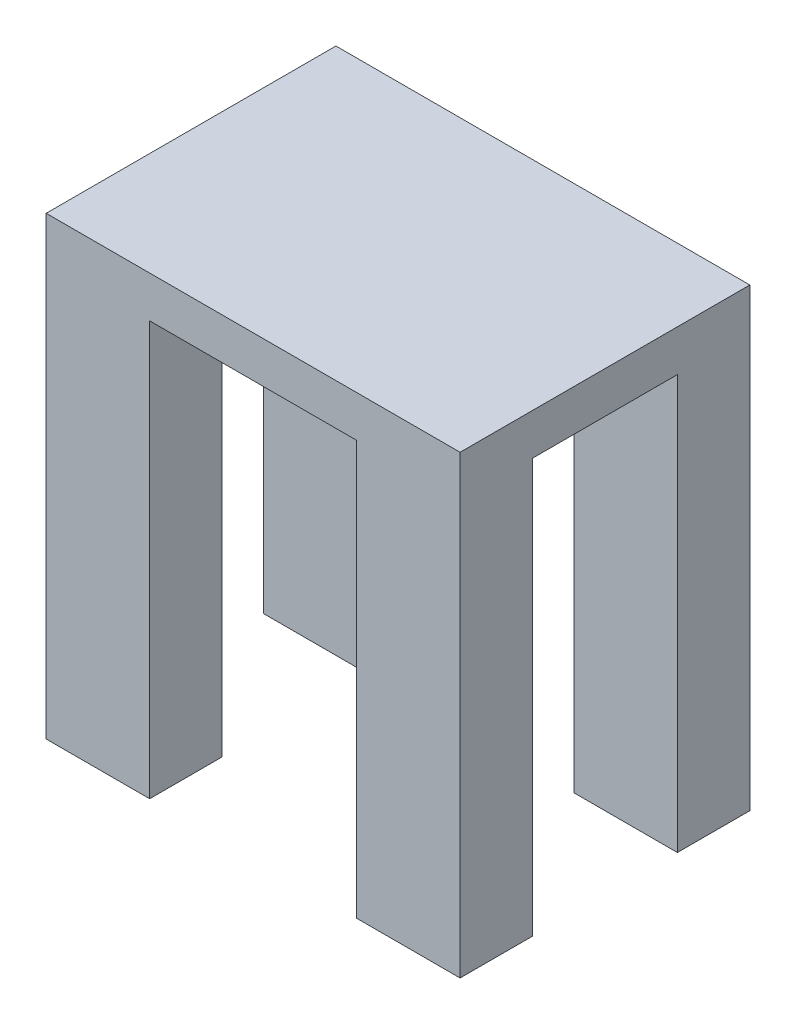
ISO-10303-21;
HEADER;
FILE_DESCRIPTION(('STEP AP214'),'2;1');
FILE_NAME('part.step','',(''),(''),'','','');
FILE_SCHEMA(('AUTOMOTIVE_DESIGN { 1 0 10303 214 1 1 1 1 }'));
ENDSEC;
DATA;
#1=APPLICATION_CONTEXT('core data for automotive mechanical design processes');
#2=APPLICATION_PROTOCOL_DEFINITION('international standard','automotive_design',2000,#1);
#3=PRODUCT_CONTEXT('',#1,'mechanical');
#4=PRODUCT('Part','Part','',(#3));
#5=PRODUCT_RELATED_PRODUCT_CATEGORY('part','',(#4));
#6=PRODUCT_DEFINITION_FORMATION('','',#4);
#7=PRODUCT_DEFINITION_CONTEXT('part definition',#1,'design');
#8=PRODUCT_DEFINITION('design','',#6,#7);
#9=PRODUCT_DEFINITION_SHAPE('','',#8);
#10=(LENGTH_UNIT() NAMED_UNIT(*) SI_UNIT(.MILLI.,.METRE.));
#11=(NAMED_UNIT(*) PLANE_ANGLE_UNIT() SI_UNIT($,.RADIAN.));
#12=(NAMED_UNIT(*) SI_UNIT($,.STERADIAN.) SOLID_ANGLE_UNIT());
#13=UNCERTAINTY_MEASURE_WITH_UNIT(LENGTH_MEASURE(1.E-05),#10,'distance_accuracy_value','');
#14=(GEOMETRIC_REPRESENTATION_CONTEXT(3) GLOBAL_UNCERTAINTY_ASSIGNED_CONTEXT((#13)) GLOBAL_UNIT_ASSIGNED_CONTEXT((#10,
#11,#12)) REPRESENTATION_CONTEXT('',''));
#15=CARTESIAN_POINT('',(0.,0.,0.));
#16=DIRECTION('',(0.,0.,1.));
#17=DIRECTION('',(1.,0.,0.));
#18=AXIS2_PLACEMENT_3D('',#15,#16,#17);
#19=CARTESIAN_POINT('',(0.,0.,0.));
#20=DIRECTION('',(0.,-1.,0.));
#21=DIRECTION('',(0.,0.,-1.));
#22=AXIS2_PLACEMENT_3D('',#19,#20,#21);
#23=PLANE('',#22);
#24=DIRECTION('',(-1.,0.,0.));
#25=VECTOR('',#24,1.);
#26=CARTESIAN_POINT('',(0.,0.,87.5));
#27=LINE('',#26,#25);
#28=CARTESIAN_POINT('',(250.,0.,87.5));
#29=VERTEX_POINT('',#28);
#30=CARTESIAN_POINT('',(125.,0.,87.5));
#31=VERTEX_POINT('',#30);
#32=EDGE_CURVE('E155',#29,#31,#27,.T.);
#33=ORIENTED_EDGE('',*,*,#32,.T.);
#34=DIRECTION('',(0.,0.,1.));
#35=VECTOR('',#34,1.);
#36=CARTESIAN_POINT('',(125.,0.,0.));
#37=LINE('',#36,#35);
#38=CARTESIAN_POINT('',(125.,0.,175.));
#39=VERTEX_POINT('',#38);
#40=EDGE_CURVE('E173',#31,#39,#37,.T.);
#41=ORIENTED_EDGE('',*,*,#40,.T.);
#42=DIRECTION('',(1.,0.,0.));
#43=VECTOR('',#42,1.);
#44=CARTESIAN_POINT('',(-250.,0.,175.));
#45=LINE('',#44,#43);
#46=CARTESIAN_POINT('',(-125.,0.,175.));
#47=VERTEX_POINT('',#46);
#48=EDGE_CURVE('E258',#47,#39,#45,.T.);
#49=ORIENTED_EDGE('',*,*,#48,.F.);
#50=DIRECTION('',(0.,0.,1.));
#51=VECTOR('',#50,1.);
#52=CARTESIAN_POINT('',(-125.,0.,0.));
#53=LINE('',#52,#51);
#54=CARTESIAN_POINT('',(-125.,0.,87.5));
#55=VERTEX_POINT('',#54);
#56=EDGE_CURVE('E233',#55,#47,#53,.T.);
#57=ORIENTED_EDGE('',*,*,#56,.F.);
#58=DIRECTION('',(1.,0.,0.));
#59=VECTOR('',#58,1.);
#60=CARTESIAN_POINT('',(0.,0.,87.5));
#61=LINE('',#60,#59);
#62=CARTESIAN_POINT('',(-250.,0.,87.5));
#63=VERTEX_POINT('',#62);
#64=EDGE_CURVE('E228',#63,#55,#61,.T.);
#65=ORIENTED_EDGE('',*,*,#64,.F.);
#66=DIRECTION('',(0.,0.,1.));
#67=VECTOR('',#66,1.);
#68=CARTESIAN_POINT('',(-250.,0.,175.));
#69=LINE('',#68,#67);
#70=CARTESIAN_POINT('',(-250.,0.,-87.5));
#71=VERTEX_POINT('',#70);
#72=EDGE_CURVE('E266',#71,#63,#69,.T.);
#73=ORIENTED_EDGE('',*,*,#72,.F.);
#74=DIRECTION('',(1.,0.,0.));
#75=VECTOR('',#74,1.);
#76=CARTESIAN_POINT('',(0.,0.,-87.5));
#77=LINE('',#76,#75);
#78=CARTESIAN_POINT('',(-125.,0.,-87.5));
#79=VERTEX_POINT('',#78);
#80=EDGE_CURVE('E204',#71,#79,#77,.T.);
#81=ORIENTED_EDGE('',*,*,#80,.T.);
#82=DIRECTION('',(0.,0.,-1.));
#83=VECTOR('',#82,1.);
#84=CARTESIAN_POINT('',(-125.,0.,0.));
#85=LINE('',#84,#83);
#86=CARTESIAN_POINT('',(-125.,0.,-175.));
#87=VERTEX_POINT('',#86);
#88=EDGE_CURVE('E209',#79,#87,#85,.T.);
#89=ORIENTED_EDGE('',*,*,#88,.T.);
#90=DIRECTION('',(-1.,0.,0.));
#91=VECTOR('',#90,1.);
#92=CARTESIAN_POINT('',(-250.,0.,-175.));
#93=LINE('',#92,#91);
#94=CARTESIAN_POINT('',(125.,0.,-175.));
#95=VERTEX_POINT('',#94);
#96=EDGE_CURVE('E55',#95,#87,#93,.T.);
#97=ORIENTED_EDGE('',*,*,#96,.F.);
#98=DIRECTION('',(0.,0.,-1.));
#99=VECTOR('',#98,1.);
#100=CARTESIAN_POINT('',(125.,0.,0.));
#101=LINE('',#100,#99);
#102=CARTESIAN_POINT('',(125.,0.,-87.5));
#103=VERTEX_POINT('',#102);
#104=EDGE_CURVE('E188',#103,#95,#101,.T.);
#105=ORIENTED_EDGE('',*,*,#104,.F.);
#106=DIRECTION('',(-1.,0.,0.));
#107=VECTOR('',#106,1.);
#108=CARTESIAN_POINT('',(0.,0.,-87.5));
#109=LINE('',#108,#107);
#110=CARTESIAN_POINT('',(250.,0.,-87.5));
#111=VERTEX_POINT('',#110);
#112=EDGE_CURVE('E158',#111,#103,#109,.T.);
#113=ORIENTED_EDGE('',*,*,#112,.F.);
#114=DIRECTION('',(0.,0.,-1.));
#115=VECTOR('',#114,1.);
#116=CARTESIAN_POINT('',(250.,0.,175.));
#117=LINE('',#116,#115);
#118=EDGE_CURVE('E253',#29,#111,#117,.T.);
#119=ORIENTED_EDGE('',*,*,#118,.F.);
#120=EDGE_LOOP('',(#33,#41,#49,#57,#65,#73,#81,#89,#97,#105,#113,#119));
#121=FACE_BOUND('',#120,.T.);
#122=ADVANCED_FACE('F35',(#121),#23,.T.);
#123=CARTESIAN_POINT('',(250.,50.,175.));
#124=DIRECTION('',(-1.,0.,0.));
#125=DIRECTION('',(0.,0.,1.));
#126=AXIS2_PLACEMENT_3D('',#123,#124,#125);
#127=PLANE('',#126);
#128=DIRECTION('',(0.,-1.,0.));
#129=VECTOR('',#128,1.);
#130=CARTESIAN_POINT('',(250.,50.,175.));
#131=LINE('',#130,#129);
#132=CARTESIAN_POINT('',(250.,50.,175.));
#133=VERTEX_POINT('',#132);
#134=CARTESIAN_POINT('',(250.,-500.,175.));
#135=VERTEX_POINT('',#134);
#136=EDGE_CURVE('E165',#133,#135,#131,.T.);
#137=ORIENTED_EDGE('',*,*,#136,.T.);
#138=DIRECTION('',(0.,0.,1.));
#139=VECTOR('',#138,1.);
#140=CARTESIAN_POINT('',(250.,-500.,0.));
#141=LINE('',#140,#139);
#142=CARTESIAN_POINT('',(250.,-500.,87.5));
#143=VERTEX_POINT('',#142);
#144=EDGE_CURVE('E162',#143,#135,#141,.T.);
#145=ORIENTED_EDGE('',*,*,#144,.F.);
#146=DIRECTION('',(0.,1.,0.));
#147=VECTOR('',#146,1.);
#148=CARTESIAN_POINT('',(250.,-500.,87.5));
#149=LINE('',#148,#147);
#150=EDGE_CURVE('E148',#143,#29,#149,.T.);
#151=ORIENTED_EDGE('',*,*,#150,.T.);
#152=ORIENTED_EDGE('',*,*,#118,.T.);
#153=DIRECTION('',(0.,1.,0.));
#154=VECTOR('',#153,1.);
#155=CARTESIAN_POINT('',(250.,-500.,-87.5));
#156=LINE('',#155,#154);
#157=CARTESIAN_POINT('',(250.,-500.,-87.5));
#158=VERTEX_POINT('',#157);
#159=EDGE_CURVE('E201',#158,#111,#156,.T.);
#160=ORIENTED_EDGE('',*,*,#159,.F.);
#161=DIRECTION('',(0.,0.,1.));
#162=VECTOR('',#161,1.);
#163=CARTESIAN_POINT('',(250.,-500.,0.));
#164=LINE('',#163,#162);
#165=CARTESIAN_POINT('',(250.,-500.,-175.));
#166=VERTEX_POINT('',#165);
#167=EDGE_CURVE('E184',#166,#158,#164,.T.);
#168=ORIENTED_EDGE('',*,*,#167,.F.);
#169=DIRECTION('',(0.,-1.,0.));
#170=VECTOR('',#169,1.);
#171=CARTESIAN_POINT('',(250.,50.,-175.));
#172=LINE('',#171,#170);
#173=CARTESIAN_POINT('',(250.,50.,-175.));
#174=VERTEX_POINT('',#173);
#175=EDGE_CURVE('E11',#174,#166,#172,.T.);
#176=ORIENTED_EDGE('',*,*,#175,.F.);
#177=DIRECTION('',(0.,0.,-1.));
#178=VECTOR('',#177,1.);
#179=CARTESIAN_POINT('',(250.,50.,175.));
#180=LINE('',#179,#178);
#181=EDGE_CURVE('E254',#133,#174,#180,.T.);
#182=ORIENTED_EDGE('',*,*,#181,.F.);
#183=EDGE_LOOP('',(#137,#145,#151,#152,#160,#168,#176,#182));
#184=FACE_BOUND('',#183,.T.);
#185=ADVANCED_FACE('F37',(#184),#127,.F.);
#186=CARTESIAN_POINT('',(-250.,50.,-175.));
#187=DIRECTION('',(0.,0.,1.));
#188=DIRECTION('',(1.,0.,0.));
#189=AXIS2_PLACEMENT_3D('',#186,#187,#188);
#190=PLANE('',#189);
#191=ORIENTED_EDGE('',*,*,#175,.T.);
#192=DIRECTION('',(1.,0.,0.));
#193=VECTOR('',#192,1.);
#194=CARTESIAN_POINT('',(0.,-500.,-175.));
#195=LINE('',#194,#193);
#196=CARTESIAN_POINT('',(125.,-500.,-175.));
#197=VERTEX_POINT('',#196);
#198=EDGE_CURVE('E192',#197,#166,#195,.T.);
#199=ORIENTED_EDGE('',*,*,#198,.F.);
#200=DIRECTION('',(0.,1.,0.));
#201=VECTOR('',#200,1.);
#202=CARTESIAN_POINT('',(125.,-500.,-175.));
#203=LINE('',#202,#201);
#204=EDGE_CURVE('E50',#197,#95,#203,.T.);
#205=ORIENTED_EDGE('',*,*,#204,.T.);
#206=ORIENTED_EDGE('',*,*,#96,.T.);
#207=DIRECTION('',(0.,1.,0.));
#208=VECTOR('',#207,1.);
#209=CARTESIAN_POINT('',(-125.,-500.,-175.));
#210=LINE('',#209,#208);
#211=CARTESIAN_POINT('',(-125.,-500.,-175.));
#212=VERTEX_POINT('',#211);
#213=EDGE_CURVE('E222',#212,#87,#210,.T.);
#214=ORIENTED_EDGE('',*,*,#213,.F.);
#215=DIRECTION('',(1.,0.,0.));
#216=VECTOR('',#215,1.);
#217=CARTESIAN_POINT('',(0.,-500.,-175.));
#218=LINE('',#217,#216);
#219=CARTESIAN_POINT('',(-250.,-500.,-175.));
#220=VERTEX_POINT('',#219);
#221=EDGE_CURVE('E212',#220,#212,#218,.T.);
#222=ORIENTED_EDGE('',*,*,#221,.F.);
#223=DIRECTION('',(0.,-1.,0.));
#224=VECTOR('',#223,1.);
#225=CARTESIAN_POINT('',(-250.,50.,-175.));
#226=LINE('',#225,#224);
#227=CARTESIAN_POINT('',(-250.,50.,-175.));
#228=VERTEX_POINT('',#227);
#229=EDGE_CURVE('E43',#228,#220,#226,.T.);
#230=ORIENTED_EDGE('',*,*,#229,.F.);
#231=DIRECTION('',(-1.,0.,0.));
#232=VECTOR('',#231,1.);
#233=CARTESIAN_POINT('',(-250.,50.,-175.));
#234=LINE('',#233,#232);
#235=EDGE_CURVE('E257',#174,#228,#234,.T.);
#236=ORIENTED_EDGE('',*,*,#235,.F.);
#237=EDGE_LOOP('',(#191,#199,#205,#206,#214,#222,#230,#236));
#238=FACE_BOUND('',#237,.T.);
#239=ADVANCED_FACE('F283',(#238),#190,.F.);
#240=CARTESIAN_POINT('',(-250.,50.,175.));
#241=DIRECTION('',(1.,0.,0.));
#242=DIRECTION('',(0.,0.,-1.));
#243=AXIS2_PLACEMENT_3D('',#240,#241,#242);
#244=PLANE('',#243);
#245=ORIENTED_EDGE('',*,*,#229,.T.);
#246=DIRECTION('',(0.,0.,-1.));
#247=VECTOR('',#246,1.);
#248=CARTESIAN_POINT('',(-250.,-500.,0.));
#249=LINE('',#248,#247);
#250=CARTESIAN_POINT('',(-250.,-500.,-87.5));
#251=VERTEX_POINT('',#250);
#252=EDGE_CURVE('E208',#251,#220,#249,.T.);
#253=ORIENTED_EDGE('',*,*,#252,.F.);
#254=DIRECTION('',(0.,1.,0.));
#255=VECTOR('',#254,1.);
#256=CARTESIAN_POINT('',(-250.,-500.,-87.5));
#257=LINE('',#256,#255);
#258=EDGE_CURVE('E225',#251,#71,#257,.T.);
#259=ORIENTED_EDGE('',*,*,#258,.T.);
#260=ORIENTED_EDGE('',*,*,#72,.T.);
#261=DIRECTION('',(0.,1.,0.));
#262=VECTOR('',#261,1.);
#263=CARTESIAN_POINT('',(-250.,-500.,87.5));
#264=LINE('',#263,#262);
#265=CARTESIAN_POINT('',(-250.,-500.,87.5));
#266=VERTEX_POINT('',#265);
#267=EDGE_CURVE('E240',#266,#63,#264,.T.);
#268=ORIENTED_EDGE('',*,*,#267,.F.);
#269=DIRECTION('',(0.,0.,-1.));
#270=VECTOR('',#269,1.);
#271=CARTESIAN_POINT('',(-250.,-500.,0.));
#272=LINE('',#271,#270);
#273=CARTESIAN_POINT('',(-250.,-500.,175.));
#274=VERTEX_POINT('',#273);
#275=EDGE_CURVE('E238',#274,#266,#272,.T.);
#276=ORIENTED_EDGE('',*,*,#275,.F.);
#277=DIRECTION('',(0.,-1.,0.));
#278=VECTOR('',#277,1.);
#279=CARTESIAN_POINT('',(-250.,50.,175.));
#280=LINE('',#279,#278);
#281=CARTESIAN_POINT('',(-250.,50.,175.));
#282=VERTEX_POINT('',#281);
#283=EDGE_CURVE('E271',#282,#274,#280,.T.);
#284=ORIENTED_EDGE('',*,*,#283,.F.);
#285=DIRECTION('',(0.,0.,1.));
#286=VECTOR('',#285,1.);
#287=CARTESIAN_POINT('',(-250.,50.,175.));
#288=LINE('',#287,#286);
#289=EDGE_CURVE('E260',#228,#282,#288,.T.);
#290=ORIENTED_EDGE('',*,*,#289,.F.);
#291=EDGE_LOOP('',(#245,#253,#259,#260,#268,#276,#284,#290));
#292=FACE_BOUND('',#291,.T.);
#293=ADVANCED_FACE('F276',(#292),#244,.F.);
#294=CARTESIAN_POINT('',(-250.,50.,175.));
#295=DIRECTION('',(0.,0.,-1.));
#296=DIRECTION('',(-1.,0.,0.));
#297=AXIS2_PLACEMENT_3D('',#294,#295,#296);
#298=PLANE('',#297);
#299=ORIENTED_EDGE('',*,*,#283,.T.);
#300=DIRECTION('',(-1.,0.,0.));
#301=VECTOR('',#300,1.);
#302=CARTESIAN_POINT('',(0.,-500.,175.));
#303=LINE('',#302,#301);
#304=CARTESIAN_POINT('',(-125.,-500.,175.));
#305=VERTEX_POINT('',#304);
#306=EDGE_CURVE('E235',#305,#274,#303,.T.);
#307=ORIENTED_EDGE('',*,*,#306,.F.);
#308=DIRECTION('',(0.,1.,0.));
#309=VECTOR('',#308,1.);
#310=CARTESIAN_POINT('',(-125.,-500.,175.));
#311=LINE('',#310,#309);
#312=EDGE_CURVE('E247',#305,#47,#311,.T.);
#313=ORIENTED_EDGE('',*,*,#312,.T.);
#314=ORIENTED_EDGE('',*,*,#48,.T.);
#315=DIRECTION('',(0.,1.,0.));
#316=VECTOR('',#315,1.);
#317=CARTESIAN_POINT('',(125.,-500.,175.));
#318=LINE('',#317,#316);
#319=CARTESIAN_POINT('',(125.,-500.,175.));
#320=VERTEX_POINT('',#319);
#321=EDGE_CURVE('E159',#320,#39,#318,.T.);
#322=ORIENTED_EDGE('',*,*,#321,.F.);
#323=DIRECTION('',(-1.,0.,0.));
#324=VECTOR('',#323,1.);
#325=CARTESIAN_POINT('',(0.,-500.,175.));
#326=LINE('',#325,#324);
#327=EDGE_CURVE('E168',#135,#320,#326,.T.);
#328=ORIENTED_EDGE('',*,*,#327,.F.);
#329=ORIENTED_EDGE('',*,*,#136,.F.);
#330=DIRECTION('',(1.,0.,0.));
#331=VECTOR('',#330,1.);
#332=CARTESIAN_POINT('',(-250.,50.,175.));
#333=LINE('',#332,#331);
#334=EDGE_CURVE('E262',#282,#133,#333,.T.);
#335=ORIENTED_EDGE('',*,*,#334,.F.);
#336=EDGE_LOOP('',(#299,#307,#313,#314,#322,#328,#329,#335));
#337=FACE_BOUND('',#336,.T.);
#338=ADVANCED_FACE('F304',(#337),#298,.F.);
#339=CARTESIAN_POINT('',(0.,50.,0.));
#340=DIRECTION('',(0.,-1.,0.));
#341=DIRECTION('',(0.,0.,-1.));
#342=AXIS2_PLACEMENT_3D('',#339,#340,#341);
#343=PLANE('',#342);
#344=ORIENTED_EDGE('',*,*,#181,.T.);
#345=ORIENTED_EDGE('',*,*,#235,.T.);
#346=ORIENTED_EDGE('',*,*,#289,.T.);
#347=ORIENTED_EDGE('',*,*,#334,.T.);
#348=EDGE_LOOP('',(#344,#345,#346,#347));
#349=FACE_BOUND('',#348,.T.);
#350=ADVANCED_FACE('F306',(#349),#343,.F.);
#351=CARTESIAN_POINT('',(0.,-500.,87.5));
#352=DIRECTION('',(0.,0.,1.));
#353=DIRECTION('',(1.,0.,0.));
#354=AXIS2_PLACEMENT_3D('',#351,#352,#353);
#355=PLANE('',#354);
#356=ORIENTED_EDGE('',*,*,#64,.T.);
#357=DIRECTION('',(0.,1.,0.));
#358=VECTOR('',#357,1.);
#359=CARTESIAN_POINT('',(-125.,-500.,87.5));
#360=LINE('',#359,#358);
#361=CARTESIAN_POINT('',(-125.,-500.,87.5));
#362=VERTEX_POINT('',#361);
#363=EDGE_CURVE('E250',#362,#55,#360,.T.);
#364=ORIENTED_EDGE('',*,*,#363,.F.);
#365=DIRECTION('',(1.,0.,0.));
#366=VECTOR('',#365,1.);
#367=CARTESIAN_POINT('',(0.,-500.,87.5));
#368=LINE('',#367,#366);
#369=EDGE_CURVE('E229',#266,#362,#368,.T.);
#370=ORIENTED_EDGE('',*,*,#369,.F.);
#371=ORIENTED_EDGE('',*,*,#267,.T.);
#372=EDGE_LOOP('',(#356,#364,#370,#371));
#373=FACE_BOUND('',#372,.T.);
#374=ADVANCED_FACE('F297',(#373),#355,.F.);
#375=CARTESIAN_POINT('',(-125.,-500.,0.));
#376=DIRECTION('',(-1.,0.,0.));
#377=DIRECTION('',(0.,0.,1.));
#378=AXIS2_PLACEMENT_3D('',#375,#376,#377);
#379=PLANE('',#378);
#380=ORIENTED_EDGE('',*,*,#56,.T.);
#381=ORIENTED_EDGE('',*,*,#312,.F.);
#382=DIRECTION('',(0.,0.,1.));
#383=VECTOR('',#382,1.);
#384=CARTESIAN_POINT('',(-125.,-500.,0.));
#385=LINE('',#384,#383);
#386=EDGE_CURVE('E232',#362,#305,#385,.T.);
#387=ORIENTED_EDGE('',*,*,#386,.F.);
#388=ORIENTED_EDGE('',*,*,#363,.T.);
#389=EDGE_LOOP('',(#380,#381,#387,#388));
#390=FACE_BOUND('',#389,.T.);
#391=ADVANCED_FACE('F363',(#390),#379,.F.);
#392=CARTESIAN_POINT('',(0.,-500.,0.));
#393=DIRECTION('',(0.,-1.,0.));
#394=DIRECTION('',(0.,0.,-1.));
#395=AXIS2_PLACEMENT_3D('',#392,#393,#394);
#396=PLANE('',#395);
#397=ORIENTED_EDGE('',*,*,#369,.T.);
#398=ORIENTED_EDGE('',*,*,#386,.T.);
#399=ORIENTED_EDGE('',*,*,#306,.T.);
#400=ORIENTED_EDGE('',*,*,#275,.T.);
#401=EDGE_LOOP('',(#397,#398,#399,#400));
#402=FACE_BOUND('',#401,.T.);
#403=ADVANCED_FACE('F299',(#402),#396,.T.);
#404=CARTESIAN_POINT('',(0.,-500.,-87.5));
#405=DIRECTION('',(0.,0.,1.));
#406=DIRECTION('',(1.,0.,0.));
#407=AXIS2_PLACEMENT_3D('',#404,#405,#406);
#408=PLANE('',#407);
#409=ORIENTED_EDGE('',*,*,#80,.F.);
#410=ORIENTED_EDGE('',*,*,#258,.F.);
#411=DIRECTION('',(1.,0.,0.));
#412=VECTOR('',#411,1.);
#413=CARTESIAN_POINT('',(0.,-500.,-87.5));
#414=LINE('',#413,#412);
#415=CARTESIAN_POINT('',(-125.,-500.,-87.5));
#416=VERTEX_POINT('',#415);
#417=EDGE_CURVE('E205',#251,#416,#414,.T.);
#418=ORIENTED_EDGE('',*,*,#417,.T.);
#419=DIRECTION('',(0.,1.,0.));
#420=VECTOR('',#419,1.);
#421=CARTESIAN_POINT('',(-125.,-500.,-87.5));
#422=LINE('',#421,#420);
#423=EDGE_CURVE('E217',#416,#79,#422,.T.);
#424=ORIENTED_EDGE('',*,*,#423,.T.);
#425=EDGE_LOOP('',(#409,#410,#418,#424));
#426=FACE_BOUND('',#425,.T.);
#427=ADVANCED_FACE('F289',(#426),#408,.T.);
#428=CARTESIAN_POINT('',(-125.,-500.,0.));
#429=DIRECTION('',(1.,0.,0.));
#430=DIRECTION('',(0.,0.,-1.));
#431=AXIS2_PLACEMENT_3D('',#428,#429,#430);
#432=PLANE('',#431);
#433=ORIENTED_EDGE('',*,*,#88,.F.);
#434=ORIENTED_EDGE('',*,*,#423,.F.);
#435=DIRECTION('',(0.,0.,-1.));
#436=VECTOR('',#435,1.);
#437=CARTESIAN_POINT('',(-125.,-500.,0.));
#438=LINE('',#437,#436);
#439=EDGE_CURVE('E214',#416,#212,#438,.T.);
#440=ORIENTED_EDGE('',*,*,#439,.T.);
#441=ORIENTED_EDGE('',*,*,#213,.T.);
#442=EDGE_LOOP('',(#433,#434,#440,#441));
#443=FACE_BOUND('',#442,.T.);
#444=ADVANCED_FACE('F286',(#443),#432,.T.);
#445=CARTESIAN_POINT('',(0.,-500.,0.));
#446=DIRECTION('',(0.,-1.,0.));
#447=DIRECTION('',(0.,0.,-1.));
#448=AXIS2_PLACEMENT_3D('',#445,#446,#447);
#449=PLANE('',#448);
#450=ORIENTED_EDGE('',*,*,#417,.F.);
#451=ORIENTED_EDGE('',*,*,#252,.T.);
#452=ORIENTED_EDGE('',*,*,#221,.T.);
#453=ORIENTED_EDGE('',*,*,#439,.F.);
#454=EDGE_LOOP('',(#450,#451,#452,#453));
#455=FACE_BOUND('',#454,.T.);
#456=ADVANCED_FACE('F281',(#455),#449,.T.);
#457=CARTESIAN_POINT('',(0.,-500.,-87.5));
#458=DIRECTION('',(0.,0.,-1.));
#459=DIRECTION('',(-1.,0.,0.));
#460=AXIS2_PLACEMENT_3D('',#457,#458,#459);
#461=PLANE('',#460);
#462=ORIENTED_EDGE('',*,*,#112,.T.);
#463=DIRECTION('',(0.,1.,0.));
#464=VECTOR('',#463,1.);
#465=CARTESIAN_POINT('',(125.,-500.,-87.5));
#466=LINE('',#465,#464);
#467=CARTESIAN_POINT('',(125.,-500.,-87.5));
#468=VERTEX_POINT('',#467);
#469=EDGE_CURVE('E198',#468,#103,#466,.T.);
#470=ORIENTED_EDGE('',*,*,#469,.F.);
#471=DIRECTION('',(-1.,0.,0.));
#472=VECTOR('',#471,1.);
#473=CARTESIAN_POINT('',(0.,-500.,-87.5));
#474=LINE('',#473,#472);
#475=EDGE_CURVE('E187',#158,#468,#474,.T.);
#476=ORIENTED_EDGE('',*,*,#475,.F.);
#477=ORIENTED_EDGE('',*,*,#159,.T.);
#478=EDGE_LOOP('',(#462,#470,#476,#477));
#479=FACE_BOUND('',#478,.T.);
#480=ADVANCED_FACE('F315',(#479),#461,.F.);
#481=CARTESIAN_POINT('',(125.,-500.,0.));
#482=DIRECTION('',(1.,0.,0.));
#483=DIRECTION('',(0.,0.,-1.));
#484=AXIS2_PLACEMENT_3D('',#481,#482,#483);
#485=PLANE('',#484);
#486=ORIENTED_EDGE('',*,*,#104,.T.);
#487=ORIENTED_EDGE('',*,*,#204,.F.);
#488=DIRECTION('',(0.,0.,-1.));
#489=VECTOR('',#488,1.);
#490=CARTESIAN_POINT('',(125.,-500.,0.));
#491=LINE('',#490,#489);
#492=EDGE_CURVE('E190',#468,#197,#491,.T.);
#493=ORIENTED_EDGE('',*,*,#492,.F.);
#494=ORIENTED_EDGE('',*,*,#469,.T.);
#495=EDGE_LOOP('',(#486,#487,#493,#494));
#496=FACE_BOUND('',#495,.T.);
#497=ADVANCED_FACE('F319',(#496),#485,.F.);
#498=CARTESIAN_POINT('',(0.,-500.,0.));
#499=DIRECTION('',(0.,-1.,0.));
#500=DIRECTION('',(0.,0.,-1.));
#501=AXIS2_PLACEMENT_3D('',#498,#499,#500);
#502=PLANE('',#501);
#503=ORIENTED_EDGE('',*,*,#167,.T.);
#504=ORIENTED_EDGE('',*,*,#475,.T.);
#505=ORIENTED_EDGE('',*,*,#492,.T.);
#506=ORIENTED_EDGE('',*,*,#198,.T.);
#507=EDGE_LOOP('',(#503,#504,#505,#506));
#508=FACE_BOUND('',#507,.T.);
#509=ADVANCED_FACE('F310',(#508),#502,.T.);
#510=CARTESIAN_POINT('',(0.,-500.,87.5));
#511=DIRECTION('',(0.,0.,-1.));
#512=DIRECTION('',(-1.,0.,0.));
#513=AXIS2_PLACEMENT_3D('',#510,#511,#512);
#514=PLANE('',#513);
#515=ORIENTED_EDGE('',*,*,#32,.F.);
#516=ORIENTED_EDGE('',*,*,#150,.F.);
#517=DIRECTION('',(-1.,0.,0.));
#518=VECTOR('',#517,1.);
#519=CARTESIAN_POINT('',(0.,-500.,87.5));
#520=LINE('',#519,#518);
#521=CARTESIAN_POINT('',(125.,-500.,87.5));
#522=VERTEX_POINT('',#521);
#523=EDGE_CURVE('E152',#143,#522,#520,.T.);
#524=ORIENTED_EDGE('',*,*,#523,.T.);
#525=DIRECTION('',(0.,1.,0.));
#526=VECTOR('',#525,1.);
#527=CARTESIAN_POINT('',(125.,-500.,87.5));
#528=LINE('',#527,#526);
#529=EDGE_CURVE('E180',#522,#31,#528,.T.);
#530=ORIENTED_EDGE('',*,*,#529,.T.);
#531=EDGE_LOOP('',(#515,#516,#524,#530));
#532=FACE_BOUND('',#531,.T.);
#533=ADVANCED_FACE('F150',(#532),#514,.T.);
#534=CARTESIAN_POINT('',(125.,-500.,0.));
#535=DIRECTION('',(-1.,0.,0.));
#536=DIRECTION('',(0.,0.,1.));
#537=AXIS2_PLACEMENT_3D('',#534,#535,#536);
#538=PLANE('',#537);
#539=ORIENTED_EDGE('',*,*,#40,.F.);
#540=ORIENTED_EDGE('',*,*,#529,.F.);
#541=DIRECTION('',(0.,0.,1.));
#542=VECTOR('',#541,1.);
#543=CARTESIAN_POINT('',(125.,-500.,0.));
#544=LINE('',#543,#542);
#545=EDGE_CURVE('E172',#522,#320,#544,.T.);
#546=ORIENTED_EDGE('',*,*,#545,.T.);
#547=ORIENTED_EDGE('',*,*,#321,.T.);
#548=EDGE_LOOP('',(#539,#540,#546,#547));
#549=FACE_BOUND('',#548,.T.);
#550=ADVANCED_FACE('F417',(#549),#538,.T.);
#551=CARTESIAN_POINT('',(0.,-500.,0.));
#552=DIRECTION('',(0.,-1.,0.));
#553=DIRECTION('',(0.,0.,-1.));
#554=AXIS2_PLACEMENT_3D('',#551,#552,#553);
#555=PLANE('',#554);
#556=ORIENTED_EDGE('',*,*,#523,.F.);
#557=ORIENTED_EDGE('',*,*,#144,.T.);
#558=ORIENTED_EDGE('',*,*,#327,.T.);
#559=ORIENTED_EDGE('',*,*,#545,.F.);
#560=EDGE_LOOP('',(#556,#557,#558,#559));
#561=FACE_BOUND('',#560,.T.);
#562=ADVANCED_FACE('F170',(#561),#555,.T.);
#563=CLOSED_SHELL('',(#122,#185,#239,#293,#338,#350,#374,#391,#403,#427,#444,#456,#480,#497,
#509,#533,#550,#562));
#564=MANIFOLD_SOLID_BREP('B2',#563);
#565=ADVANCED_BREP_SHAPE_REPRESENTATION('',(#18,#564),#14);
#566=SHAPE_DEFINITION_REPRESENTATION(#9,#565);
ENDSEC;
END-ISO-10303-21;
